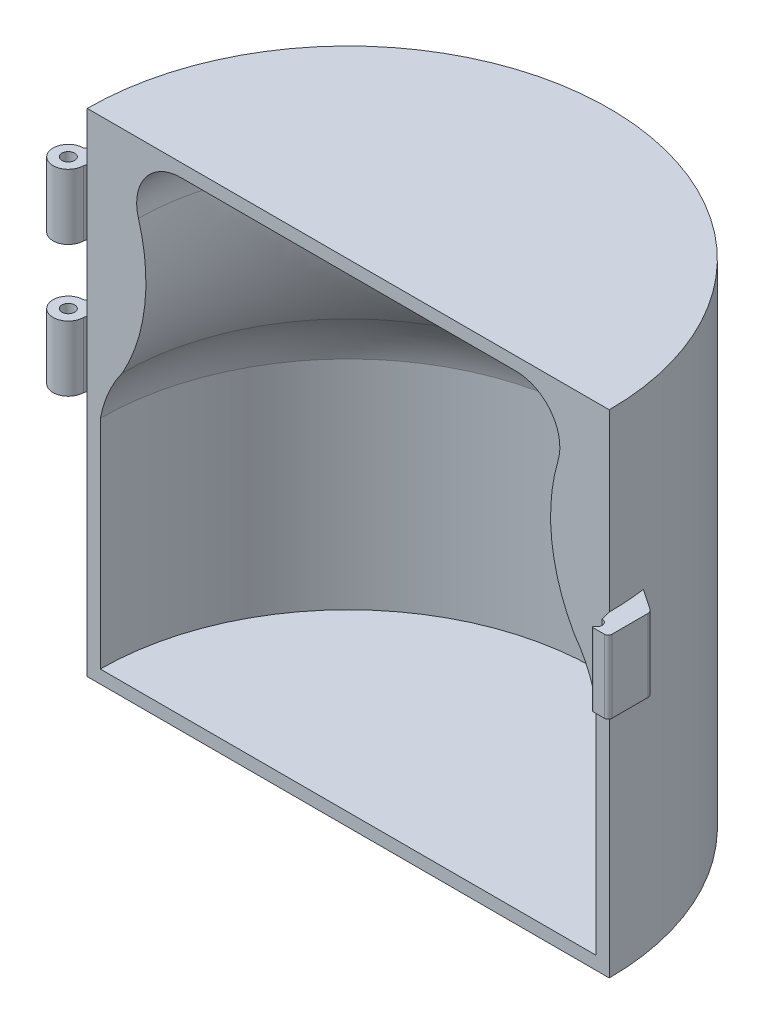
ISO-10303-21;
HEADER;
FILE_DESCRIPTION(('STEP AP214'),'2;1');
FILE_NAME('part.step','',(''),(''),'','','');
FILE_SCHEMA(('AUTOMOTIVE_DESIGN { 1 0 10303 214 1 1 1 1 }'));
ENDSEC;
DATA;
#1=APPLICATION_CONTEXT('core data for automotive mechanical design processes');
#2=APPLICATION_PROTOCOL_DEFINITION('international standard','automotive_design',2000,#1);
#3=PRODUCT_CONTEXT('',#1,'mechanical');
#4=PRODUCT('Part','Part','',(#3));
#5=PRODUCT_RELATED_PRODUCT_CATEGORY('part','',(#4));
#6=PRODUCT_DEFINITION_FORMATION('','',#4);
#7=PRODUCT_DEFINITION_CONTEXT('part definition',#1,'design');
#8=PRODUCT_DEFINITION('design','',#6,#7);
#9=PRODUCT_DEFINITION_SHAPE('','',#8);
#10=(LENGTH_UNIT() NAMED_UNIT(*) SI_UNIT(.MILLI.,.METRE.));
#11=(NAMED_UNIT(*) PLANE_ANGLE_UNIT() SI_UNIT($,.RADIAN.));
#12=(NAMED_UNIT(*) SI_UNIT($,.STERADIAN.) SOLID_ANGLE_UNIT());
#13=UNCERTAINTY_MEASURE_WITH_UNIT(LENGTH_MEASURE(1.E-05),#10,'distance_accuracy_value','');
#14=(GEOMETRIC_REPRESENTATION_CONTEXT(3) GLOBAL_UNCERTAINTY_ASSIGNED_CONTEXT((#13)) GLOBAL_UNIT_ASSIGNED_CONTEXT((#10,
#11,#12)) REPRESENTATION_CONTEXT('',''));
#15=CARTESIAN_POINT('',(0.,0.,0.));
#16=DIRECTION('',(0.,0.,1.));
#17=DIRECTION('',(1.,0.,0.));
#18=AXIS2_PLACEMENT_3D('',#15,#16,#17);
#19=CARTESIAN_POINT('',(-38.45,-5.,0.));
#20=DIRECTION('',(0.,1.,0.));
#21=DIRECTION('',(0.,0.,1.));
#22=AXIS2_PLACEMENT_3D('',#19,#20,#21);
#23=CYLINDRICAL_SURFACE('',#22,2.1);
#24=CARTESIAN_POINT('',(-38.45,13.05,0.));
#25=DIRECTION('',(0.,1.,0.));
#26=DIRECTION('',(0.,0.,1.));
#27=AXIS2_PLACEMENT_3D('',#24,#25,#26);
#28=CIRCLE('',#27,2.1);
#29=CARTESIAN_POINT('',(-36.3500000000001,13.05,-6.34160605863902E-07));
#30=VERTEX_POINT('',#29);
#31=CARTESIAN_POINT('',(-38.45,13.05,-2.1));
#32=VERTEX_POINT('',#31);
#33=EDGE_CURVE('E308',#30,#32,#28,.F.);
#34=ORIENTED_EDGE('',*,*,#33,.F.);
#35=DIRECTION('',(0.,1.,0.));
#36=VECTOR('',#35,1.);
#37=CARTESIAN_POINT('',(-36.3500000000001,-5.,-6.34160605972323E-07));
#38=LINE('',#37,#36);
#39=CARTESIAN_POINT('',(-36.3500000000001,22.,-6.34160605972323E-07));
#40=VERTEX_POINT('',#39);
#41=EDGE_CURVE('E233',#30,#40,#38,.T.);
#42=ORIENTED_EDGE('',*,*,#41,.T.);
#43=CARTESIAN_POINT('',(-38.45,22.,0.));
#44=DIRECTION('',(0.,1.,0.));
#45=DIRECTION('',(0.,0.,1.));
#46=AXIS2_PLACEMENT_3D('',#43,#44,#45);
#47=CIRCLE('',#46,2.1);
#48=CARTESIAN_POINT('',(-38.45,22.,-2.1));
#49=VERTEX_POINT('',#48);
#50=EDGE_CURVE('E392',#49,#40,#47,.T.);
#51=ORIENTED_EDGE('',*,*,#50,.F.);
#52=DIRECTION('',(0.,1.,0.));
#53=VECTOR('',#52,1.);
#54=CARTESIAN_POINT('',(-38.45,-5.,-2.1));
#55=LINE('',#54,#53);
#56=EDGE_CURVE('E221',#32,#49,#55,.T.);
#57=ORIENTED_EDGE('',*,*,#56,.F.);
#58=EDGE_LOOP('',(#34,#42,#51,#57));
#59=FACE_BOUND('',#58,.T.);
#60=ADVANCED_FACE('F33',(#59),#23,.T.);
#61=CARTESIAN_POINT('',(-59.4902150576124,-5.,-29.3458485788646));
#62=DIRECTION('',(0.,1.,0.));
#63=DIRECTION('',(0.,0.,1.));
#64=AXIS2_PLACEMENT_3D('',#61,#62,#63);
#65=CYLINDRICAL_SURFACE('',#64,34.4242198815456);
#66=CARTESIAN_POINT('',(-59.4902150576124,13.05,-29.3458485788646));
#67=DIRECTION('',(0.,1.,0.));
#68=DIRECTION('',(0.,0.,1.));
#69=AXIS2_PLACEMENT_3D('',#66,#67,#68);
#70=CIRCLE('',#69,34.4242198815456);
#71=CARTESIAN_POINT('',(-35.5527923727381,13.05,-4.60667499406875));
#72=VERTEX_POINT('',#71);
#73=EDGE_CURVE('E310',#32,#72,#70,.T.);
#74=ORIENTED_EDGE('',*,*,#73,.F.);
#75=ORIENTED_EDGE('',*,*,#56,.T.);
#76=CARTESIAN_POINT('',(-59.4902150576124,22.,-29.3458485788646));
#77=DIRECTION('',(0.,-1.,0.));
#78=DIRECTION('',(0.,0.,-1.));
#79=AXIS2_PLACEMENT_3D('',#76,#77,#78);
#80=CIRCLE('',#79,34.4242198815456);
#81=CARTESIAN_POINT('',(-35.5527923727381,22.,-4.60667499406874));
#82=VERTEX_POINT('',#81);
#83=EDGE_CURVE('E398',#82,#49,#80,.T.);
#84=ORIENTED_EDGE('',*,*,#83,.F.);
#85=DIRECTION('',(0.,1.,0.));
#86=VECTOR('',#85,1.);
#87=CARTESIAN_POINT('',(-35.5527923727381,-5.,-4.60667499406874));
#88=LINE('',#87,#86);
#89=EDGE_CURVE('E222',#72,#82,#88,.T.);
#90=ORIENTED_EDGE('',*,*,#89,.F.);
#91=EDGE_LOOP('',(#74,#75,#84,#90));
#92=FACE_BOUND('',#91,.T.);
#93=ADVANCED_FACE('F426',(#92),#65,.F.);
#94=CARTESIAN_POINT('',(-34.0891134906964,-5.,0.498090304903012));
#95=DIRECTION('',(0.,1.,0.));
#96=DIRECTION('',(0.,0.,1.));
#97=AXIS2_PLACEMENT_3D('',#94,#95,#96);
#98=CYLINDRICAL_SURFACE('',#97,2.31510310602543);
#99=CARTESIAN_POINT('',(-34.0891134906964,13.05,0.498090304903012));
#100=DIRECTION('',(0.,1.,0.));
#101=DIRECTION('',(0.,0.,1.));
#102=AXIS2_PLACEMENT_3D('',#99,#100,#101);
#103=CIRCLE('',#102,2.31510310602543);
#104=CARTESIAN_POINT('',(-35.8354353622414,13.05,-1.02179860962072));
#105=VERTEX_POINT('',#104);
#106=EDGE_CURVE('E306',#105,#30,#103,.T.);
#107=ORIENTED_EDGE('',*,*,#106,.F.);
#108=DIRECTION('',(0.,1.,0.));
#109=VECTOR('',#108,1.);
#110=CARTESIAN_POINT('',(-35.8354353622413,-5.,-1.02179860962083));
#111=LINE('',#110,#109);
#112=CARTESIAN_POINT('',(-35.8354353622413,22.,-1.02179860962086));
#113=VERTEX_POINT('',#112);
#114=EDGE_CURVE('E229',#105,#113,#111,.T.);
#115=ORIENTED_EDGE('',*,*,#114,.T.);
#116=CARTESIAN_POINT('',(-34.0891134906964,22.,0.498090304903012));
#117=DIRECTION('',(0.,-1.,0.));
#118=DIRECTION('',(0.,0.,-1.));
#119=AXIS2_PLACEMENT_3D('',#116,#117,#118);
#120=CIRCLE('',#119,2.31510310602543);
#121=EDGE_CURVE('E395',#40,#113,#120,.T.);
#122=ORIENTED_EDGE('',*,*,#121,.F.);
#123=ORIENTED_EDGE('',*,*,#41,.F.);
#124=EDGE_LOOP('',(#107,#115,#122,#123));
#125=FACE_BOUND('',#124,.T.);
#126=ADVANCED_FACE('F416',(#125),#98,.F.);
#127=CARTESIAN_POINT('',(-38.45,-5.,0.));
#128=DIRECTION('',(0.,1.,0.));
#129=DIRECTION('',(0.,0.,1.));
#130=AXIS2_PLACEMENT_3D('',#127,#128,#129);
#131=CYLINDRICAL_SURFACE('',#130,0.874999999999998);
#132=CARTESIAN_POINT('',(-38.45,13.05,0.));
#133=DIRECTION('',(0.,1.,0.));
#134=DIRECTION('',(0.,0.,1.));
#135=AXIS2_PLACEMENT_3D('',#132,#133,#134);
#136=CIRCLE('',#135,0.874999999999998);
#137=CARTESIAN_POINT('',(-38.45,13.05,0.874999999999998));
#138=VERTEX_POINT('',#137);
#139=EDGE_CURVE('E37',#138,#138,#136,.F.);
#140=ORIENTED_EDGE('',*,*,#139,.T.);
#141=EDGE_LOOP('',(#140));
#142=FACE_BOUND('',#141,.T.);
#143=CARTESIAN_POINT('',(-38.45,22.,0.));
#144=DIRECTION('',(0.,1.,0.));
#145=DIRECTION('',(0.,0.,1.));
#146=AXIS2_PLACEMENT_3D('',#143,#144,#145);
#147=CIRCLE('',#146,0.874999999999998);
#148=CARTESIAN_POINT('',(-38.45,22.,0.874999999999998));
#149=VERTEX_POINT('',#148);
#150=EDGE_CURVE('E371',#149,#149,#147,.T.);
#151=ORIENTED_EDGE('',*,*,#150,.T.);
#152=EDGE_LOOP('',(#151));
#153=FACE_BOUND('',#152,.T.);
#154=ADVANCED_FACE('F432',(#142,#153),#131,.F.);
#155=CARTESIAN_POINT('',(0.,0.,0.));
#156=DIRECTION('',(0.,-1.,0.));
#157=DIRECTION('',(0.,0.,-1.));
#158=AXIS2_PLACEMENT_3D('',#155,#156,#157);
#159=CYLINDRICAL_SURFACE('',#158,35.85);
#160=ORIENTED_EDGE('',*,*,#114,.F.);
#161=CARTESIAN_POINT('',(0.,13.05,0.));
#162=DIRECTION('',(0.,1.,0.));
#163=DIRECTION('',(0.,0.,1.));
#164=AXIS2_PLACEMENT_3D('',#161,#162,#163);
#165=CIRCLE('',#164,35.85);
#166=EDGE_CURVE('E208',#72,#105,#165,.T.);
#167=ORIENTED_EDGE('',*,*,#166,.F.);
#168=ORIENTED_EDGE('',*,*,#89,.T.);
#169=CARTESIAN_POINT('',(0.,22.,0.));
#170=DIRECTION('',(0.,1.,0.));
#171=DIRECTION('',(0.,0.,1.));
#172=AXIS2_PLACEMENT_3D('',#169,#170,#171);
#173=CIRCLE('',#172,35.85);
#174=EDGE_CURVE('E42',#113,#82,#173,.F.);
#175=ORIENTED_EDGE('',*,*,#174,.F.);
#176=EDGE_LOOP('',(#160,#167,#168,#175));
#177=FACE_BOUND('',#176,.T.);
#178=DIRECTION('',(0.,1.,0.));
#179=VECTOR('',#178,1.);
#180=CARTESIAN_POINT('',(-35.85,29.0591591337267,2.50339211995053E-13));
#181=LINE('',#180,#179);
#182=CARTESIAN_POINT('',(-35.85,-38.5269912109226,2.50339211995053E-13));
#183=VERTEX_POINT('',#182);
#184=CARTESIAN_POINT('',(-35.85,29.0591591337267,2.50339211995053E-13));
#185=VERTEX_POINT('',#184);
#186=EDGE_CURVE('E270',#183,#185,#181,.T.);
#187=ORIENTED_EDGE('',*,*,#186,.T.);
#188=CARTESIAN_POINT('',(0.,29.0591591337267,0.));
#189=DIRECTION('',(0.,-1.,0.));
#190=DIRECTION('',(0.,0.,-1.));
#191=AXIS2_PLACEMENT_3D('',#188,#189,#190);
#192=CIRCLE('',#191,35.85);
#193=CARTESIAN_POINT('',(35.85,29.0591591337267,0.));
#194=VERTEX_POINT('',#193);
#195=EDGE_CURVE('E290',#185,#194,#192,.T.);
#196=ORIENTED_EDGE('',*,*,#195,.T.);
#197=DIRECTION('',(0.,1.,0.));
#198=VECTOR('',#197,1.);
#199=CARTESIAN_POINT('',(35.85,29.0591591337267,0.));
#200=LINE('',#199,#198);
#201=CARTESIAN_POINT('',(35.85,5.,0.));
#202=VERTEX_POINT('',#201);
#203=EDGE_CURVE('E246',#202,#194,#200,.T.);
#204=ORIENTED_EDGE('',*,*,#203,.F.);
#205=CARTESIAN_POINT('',(0.,5.,0.));
#206=DIRECTION('',(0.,-1.,0.));
#207=DIRECTION('',(0.,0.,-1.));
#208=AXIS2_PLACEMENT_3D('',#205,#206,#207);
#209=CIRCLE('',#208,35.85);
#210=CARTESIAN_POINT('',(35.4945281124585,5.,-5.03596803741779));
#211=VERTEX_POINT('',#210);
#212=EDGE_CURVE('E336',#211,#202,#209,.T.);
#213=ORIENTED_EDGE('',*,*,#212,.F.);
#214=DIRECTION('',(0.,1.,0.));
#215=VECTOR('',#214,1.);
#216=CARTESIAN_POINT('',(35.4945281124585,-5.,-5.03596803741779));
#217=LINE('',#216,#215);
#218=CARTESIAN_POINT('',(35.4945281124585,-5.,-5.03596803741779));
#219=VERTEX_POINT('',#218);
#220=EDGE_CURVE('E375',#219,#211,#217,.T.);
#221=ORIENTED_EDGE('',*,*,#220,.F.);
#222=CARTESIAN_POINT('',(0.,-5.,0.));
#223=DIRECTION('',(0.,-1.,0.));
#224=DIRECTION('',(0.,0.,-1.));
#225=AXIS2_PLACEMENT_3D('',#222,#223,#224);
#226=CIRCLE('',#225,35.85);
#227=CARTESIAN_POINT('',(35.85,-5.,0.));
#228=VERTEX_POINT('',#227);
#229=EDGE_CURVE('E362',#219,#228,#226,.T.);
#230=ORIENTED_EDGE('',*,*,#229,.T.);
#231=CARTESIAN_POINT('',(35.85,-38.5269912109226,0.));
#232=VERTEX_POINT('',#231);
#233=EDGE_CURVE('E247',#232,#228,#200,.T.);
#234=ORIENTED_EDGE('',*,*,#233,.F.);
#235=CARTESIAN_POINT('',(0.,-38.5269912109226,0.));
#236=DIRECTION('',(0.,-1.,0.));
#237=DIRECTION('',(0.,0.,-1.));
#238=AXIS2_PLACEMENT_3D('',#235,#236,#237);
#239=CIRCLE('',#238,35.85);
#240=EDGE_CURVE('E287',#183,#232,#239,.T.);
#241=ORIENTED_EDGE('',*,*,#240,.F.);
#242=EDGE_LOOP('',(#187,#196,#204,#213,#221,#230,#234,#241));
#243=FACE_BOUND('',#242,.T.);
#244=CARTESIAN_POINT('',(-35.5527923727381,-5.,-4.60667499406871));
#245=VERTEX_POINT('',#244);
#246=CARTESIAN_POINT('',(-35.5527923727381,3.95,-4.60667499406875));
#247=VERTEX_POINT('',#246);
#248=EDGE_CURVE('E215',#245,#247,#88,.T.);
#249=ORIENTED_EDGE('',*,*,#248,.T.);
#250=CARTESIAN_POINT('',(0.,3.95,0.));
#251=DIRECTION('',(0.,1.,0.));
#252=DIRECTION('',(0.,0.,1.));
#253=AXIS2_PLACEMENT_3D('',#250,#251,#252);
#254=CIRCLE('',#253,35.85);
#255=CARTESIAN_POINT('',(-35.8354353622414,3.95,-1.02179860962072));
#256=VERTEX_POINT('',#255);
#257=EDGE_CURVE('E199',#247,#256,#254,.T.);
#258=ORIENTED_EDGE('',*,*,#257,.T.);
#259=CARTESIAN_POINT('',(-35.8354353622413,-5.,-1.02179860962089));
#260=VERTEX_POINT('',#259);
#261=EDGE_CURVE('E225',#260,#256,#111,.T.);
#262=ORIENTED_EDGE('',*,*,#261,.F.);
#263=CARTESIAN_POINT('',(0.,-5.,0.));
#264=DIRECTION('',(0.,1.,0.));
#265=DIRECTION('',(0.,0.,1.));
#266=AXIS2_PLACEMENT_3D('',#263,#264,#265);
#267=CIRCLE('',#266,35.85);
#268=EDGE_CURVE('E11',#260,#245,#267,.F.);
#269=ORIENTED_EDGE('',*,*,#268,.T.);
#270=EDGE_LOOP('',(#249,#258,#262,#269));
#271=FACE_BOUND('',#270,.T.);
#272=ADVANCED_FACE('F219',(#177,#243,#271),#159,.T.);
#273=CARTESIAN_POINT('',(0.,29.0591591337267,0.));
#274=DIRECTION('',(0.,1.,0.));
#275=DIRECTION('',(0.,0.,1.));
#276=AXIS2_PLACEMENT_3D('',#273,#274,#275);
#277=PLANE('',#276);
#278=ORIENTED_EDGE('',*,*,#195,.F.);
#279=DIRECTION('',(1.,0.,0.));
#280=VECTOR('',#279,1.);
#281=CARTESIAN_POINT('',(0.,29.0591591337267,0.));
#282=LINE('',#281,#280);
#283=EDGE_CURVE('E272',#185,#194,#282,.T.);
#284=ORIENTED_EDGE('',*,*,#283,.T.);
#285=EDGE_LOOP('',(#278,#284));
#286=FACE_BOUND('',#285,.T.);
#287=ADVANCED_FACE('F35',(#286),#277,.T.);
#288=CARTESIAN_POINT('',(-35.85,-38.5269912109226,2.50339211995053E-13));
#289=DIRECTION('',(0.,-1.,0.));
#290=DIRECTION('',(0.,0.,-1.));
#291=AXIS2_PLACEMENT_3D('',#288,#289,#290);
#292=PLANE('',#291);
#293=ORIENTED_EDGE('',*,*,#240,.T.);
#294=DIRECTION('',(-1.,0.,0.));
#295=VECTOR('',#294,1.);
#296=CARTESIAN_POINT('',(-35.85,-38.5269912109226,2.50339211995053E-13));
#297=LINE('',#296,#295);
#298=EDGE_CURVE('E267',#232,#183,#297,.T.);
#299=ORIENTED_EDGE('',*,*,#298,.T.);
#300=EDGE_LOOP('',(#293,#299));
#301=FACE_BOUND('',#300,.T.);
#302=ADVANCED_FACE('F756',(#301),#292,.T.);
#303=CARTESIAN_POINT('',(0.,-36.7269912109226,0.));
#304=DIRECTION('',(0.,1.,0.));
#305=DIRECTION('',(0.,0.,1.));
#306=AXIS2_PLACEMENT_3D('',#303,#304,#305);
#307=PLANE('',#306);
#308=CARTESIAN_POINT('',(0.,-36.7269912109226,0.));
#309=DIRECTION('',(0.,-1.,0.));
#310=DIRECTION('',(0.,0.,-1.));
#311=AXIS2_PLACEMENT_3D('',#308,#309,#310);
#312=CIRCLE('',#311,34.05);
#313=CARTESIAN_POINT('',(-34.05,-36.7269912109226,2.37769879175217E-13));
#314=VERTEX_POINT('',#313);
#315=CARTESIAN_POINT('',(34.05,-36.7269912109226,0.));
#316=VERTEX_POINT('',#315);
#317=EDGE_CURVE('E284',#314,#316,#312,.T.);
#318=ORIENTED_EDGE('',*,*,#317,.F.);
#319=DIRECTION('',(1.,0.,0.));
#320=VECTOR('',#319,1.);
#321=CARTESIAN_POINT('',(0.,-36.7269912109226,0.));
#322=LINE('',#321,#320);
#323=EDGE_CURVE('E265',#314,#316,#322,.T.);
#324=ORIENTED_EDGE('',*,*,#323,.T.);
#325=EDGE_LOOP('',(#318,#324));
#326=FACE_BOUND('',#325,.T.);
#327=ADVANCED_FACE('F746',(#326),#307,.T.);
#328=CARTESIAN_POINT('',(0.,0.,0.));
#329=DIRECTION('',(0.,-1.,0.));
#330=DIRECTION('',(0.,0.,-1.));
#331=AXIS2_PLACEMENT_3D('',#328,#329,#330);
#332=CYLINDRICAL_SURFACE('',#331,34.05);
#333=CARTESIAN_POINT('',(0.,-6.89650099036191,0.));
#334=DIRECTION('',(0.,-1.,0.));
#335=DIRECTION('',(0.,0.,-1.));
#336=AXIS2_PLACEMENT_3D('',#333,#334,#335);
#337=CIRCLE('',#336,34.05);
#338=CARTESIAN_POINT('',(-34.05,-6.89650099036191,2.37769879175217E-13));
#339=VERTEX_POINT('',#338);
#340=CARTESIAN_POINT('',(34.05,-6.89650099036191,0.));
#341=VERTEX_POINT('',#340);
#342=EDGE_CURVE('E282',#339,#341,#337,.T.);
#343=ORIENTED_EDGE('',*,*,#342,.F.);
#344=DIRECTION('',(0.,-1.,0.));
#345=VECTOR('',#344,1.);
#346=CARTESIAN_POINT('',(-34.05,-36.7269912109226,2.37769879175217E-13));
#347=LINE('',#346,#345);
#348=EDGE_CURVE('E262',#339,#314,#347,.T.);
#349=ORIENTED_EDGE('',*,*,#348,.T.);
#350=ORIENTED_EDGE('',*,*,#317,.T.);
#351=DIRECTION('',(0.,-1.,0.));
#352=VECTOR('',#351,1.);
#353=CARTESIAN_POINT('',(34.05,-36.7269912109226,0.));
#354=LINE('',#353,#352);
#355=EDGE_CURVE('E243',#341,#316,#354,.T.);
#356=ORIENTED_EDGE('',*,*,#355,.F.);
#357=EDGE_LOOP('',(#343,#349,#350,#356));
#358=FACE_BOUND('',#357,.T.);
#359=ADVANCED_FACE('F736',(#358),#332,.F.);
#360=CARTESIAN_POINT('',(0.,-10.1856188509149,0.));
#361=DIRECTION('',(0.,-1.,0.));
#362=DIRECTION('',(0.,0.,-1.));
#363=AXIS2_PLACEMENT_3D('',#360,#361,#362);
#364=DEGENERATE_TOROIDAL_SURFACE('',#363,17.14840529501,17.2186584806237,.T.);
#365=CARTESIAN_POINT('',(0.,0.0271496236617253,0.));
#366=DIRECTION('',(0.,-1.,0.));
#367=DIRECTION('',(0.,0.,-1.));
#368=AXIS2_PLACEMENT_3D('',#365,#366,#367);
#369=CIRCLE('',#368,31.011361688112);
#370=CARTESIAN_POINT('',(-31.011361688112,0.0271496236617253,2.16551181252316E-13));
#371=VERTEX_POINT('',#370);
#372=CARTESIAN_POINT('',(31.011361688112,0.0271496236617253,0.));
#373=VERTEX_POINT('',#372);
#374=EDGE_CURVE('E280',#371,#373,#369,.T.);
#375=ORIENTED_EDGE('',*,*,#374,.F.);
#376=CARTESIAN_POINT('',(-17.14840529501,-10.1856188509149,1.19746674156893E-13));
#377=DIRECTION('',(0.,0.,1.));
#378=DIRECTION('',(1.,0.,0.));
#379=AXIS2_PLACEMENT_3D('',#376,#377,#378);
#380=CIRCLE('',#379,17.2186584806237);
#381=EDGE_CURVE('E259',#371,#339,#380,.T.);
#382=ORIENTED_EDGE('',*,*,#381,.T.);
#383=ORIENTED_EDGE('',*,*,#342,.T.);
#384=CARTESIAN_POINT('',(17.14840529501,-10.1856188509149,0.));
#385=DIRECTION('',(0.,0.,-1.));
#386=DIRECTION('',(-1.,0.,0.));
#387=AXIS2_PLACEMENT_3D('',#384,#385,#386);
#388=CIRCLE('',#387,17.2186584806237);
#389=EDGE_CURVE('E240',#373,#341,#388,.T.);
#390=ORIENTED_EDGE('',*,*,#389,.F.);
#391=EDGE_LOOP('',(#375,#382,#383,#390));
#392=FACE_BOUND('',#391,.T.);
#393=ADVANCED_FACE('F726',(#392),#364,.F.);
#394=CARTESIAN_POINT('',(0.,12.3742670743194,0.));
#395=DIRECTION('',(0.,-1.,0.));
#396=DIRECTION('',(0.,0.,-1.));
#397=AXIS2_PLACEMENT_3D('',#394,#395,#396);
#398=TOROIDAL_SURFACE('',#397,53.0641731807485,25.2740539698343);
#399=CARTESIAN_POINT('',(0.,19.5027677129071,0.));
#400=DIRECTION('',(0.,-1.,0.));
#401=DIRECTION('',(0.,0.,-1.));
#402=AXIS2_PLACEMENT_3D('',#399,#400,#401);
#403=CIRCLE('',#402,28.8162396045497);
#404=CARTESIAN_POINT('',(-28.8162396045497,19.5027677129071,2.01222725669836E-13));
#405=VERTEX_POINT('',#404);
#406=CARTESIAN_POINT('',(28.8162396045497,19.5027677129071,0.));
#407=VERTEX_POINT('',#406);
#408=EDGE_CURVE('E278',#405,#407,#403,.T.);
#409=ORIENTED_EDGE('',*,*,#408,.F.);
#410=CARTESIAN_POINT('',(-53.0641731807485,12.3742670743194,3.70545140843448E-13));
#411=DIRECTION('',(0.,0.,-1.));
#412=DIRECTION('',(1.,0.,0.));
#413=AXIS2_PLACEMENT_3D('',#410,#411,#412);
#414=CIRCLE('',#413,25.2740539698343);
#415=EDGE_CURVE('E256',#405,#371,#414,.T.);
#416=ORIENTED_EDGE('',*,*,#415,.T.);
#417=ORIENTED_EDGE('',*,*,#374,.T.);
#418=CARTESIAN_POINT('',(53.0641731807485,12.3742670743194,0.));
#419=DIRECTION('',(0.,0.,1.));
#420=DIRECTION('',(-1.,0.,0.));
#421=AXIS2_PLACEMENT_3D('',#418,#419,#420);
#422=CIRCLE('',#421,25.2740539698343);
#423=EDGE_CURVE('E237',#407,#373,#422,.T.);
#424=ORIENTED_EDGE('',*,*,#423,.F.);
#425=EDGE_LOOP('',(#409,#416,#417,#424));
#426=FACE_BOUND('',#425,.T.);
#427=ADVANCED_FACE('F716',(#426),#398,.T.);
#428=CARTESIAN_POINT('',(0.,21.2091591337267,0.));
#429=DIRECTION('',(0.,-1.,0.));
#430=DIRECTION('',(0.,0.,-1.));
#431=AXIS2_PLACEMENT_3D('',#428,#429,#430);
#432=TOROIDAL_SURFACE('',#431,23.0118681210079,6.05);
#433=CARTESIAN_POINT('',(0.,27.2591591337267,0.));
#434=DIRECTION('',(0.,-1.,0.));
#435=DIRECTION('',(0.,0.,-1.));
#436=AXIS2_PLACEMENT_3D('',#433,#434,#435);
#437=CIRCLE('',#436,23.0118681210079);
#438=CARTESIAN_POINT('',(-23.0118681210079,27.2591591337267,1.60691016232837E-13));
#439=VERTEX_POINT('',#438);
#440=CARTESIAN_POINT('',(23.0118681210079,27.2591591337267,0.));
#441=VERTEX_POINT('',#440);
#442=EDGE_CURVE('E275',#439,#441,#437,.T.);
#443=ORIENTED_EDGE('',*,*,#442,.F.);
#444=CARTESIAN_POINT('',(-23.0118681210079,21.2091591337267,1.60691016232837E-13));
#445=DIRECTION('',(0.,0.,1.));
#446=DIRECTION('',(-1.,0.,0.));
#447=AXIS2_PLACEMENT_3D('',#444,#445,#446);
#448=CIRCLE('',#447,6.05);
#449=EDGE_CURVE('E253',#439,#405,#448,.T.);
#450=ORIENTED_EDGE('',*,*,#449,.T.);
#451=ORIENTED_EDGE('',*,*,#408,.T.);
#452=CARTESIAN_POINT('',(23.0118681210079,21.2091591337267,0.));
#453=DIRECTION('',(0.,0.,-1.));
#454=DIRECTION('',(1.,0.,0.));
#455=AXIS2_PLACEMENT_3D('',#452,#453,#454);
#456=CIRCLE('',#455,6.05);
#457=EDGE_CURVE('E234',#441,#407,#456,.T.);
#458=ORIENTED_EDGE('',*,*,#457,.F.);
#459=EDGE_LOOP('',(#443,#450,#451,#458));
#460=FACE_BOUND('',#459,.T.);
#461=ADVANCED_FACE('F706',(#460),#432,.F.);
#462=CARTESIAN_POINT('',(0.,27.2591591337267,0.));
#463=DIRECTION('',(0.,-1.,0.));
#464=DIRECTION('',(0.,0.,-1.));
#465=AXIS2_PLACEMENT_3D('',#462,#463,#464);
#466=PLANE('',#465);
#467=DIRECTION('',(-1.,0.,0.));
#468=VECTOR('',#467,1.);
#469=CARTESIAN_POINT('',(0.,27.2591591337267,0.));
#470=LINE('',#469,#468);
#471=EDGE_CURVE('E250',#441,#439,#470,.T.);
#472=ORIENTED_EDGE('',*,*,#471,.T.);
#473=ORIENTED_EDGE('',*,*,#442,.T.);
#474=EDGE_LOOP('',(#472,#473));
#475=FACE_BOUND('',#474,.T.);
#476=ADVANCED_FACE('F506',(#475),#466,.T.);
#477=CARTESIAN_POINT('',(-17.14840529501,-10.1856188509149,1.19746674156893E-13));
#478=DIRECTION('',(0.,0.,1.));
#479=DIRECTION('',(1.,0.,0.));
#480=AXIS2_PLACEMENT_3D('',#477,#478,#479);
#481=PLANE('',#480);
#482=ORIENTED_EDGE('',*,*,#471,.F.);
#483=ORIENTED_EDGE('',*,*,#457,.T.);
#484=ORIENTED_EDGE('',*,*,#423,.T.);
#485=ORIENTED_EDGE('',*,*,#389,.T.);
#486=ORIENTED_EDGE('',*,*,#355,.T.);
#487=ORIENTED_EDGE('',*,*,#323,.F.);
#488=ORIENTED_EDGE('',*,*,#348,.F.);
#489=ORIENTED_EDGE('',*,*,#381,.F.);
#490=ORIENTED_EDGE('',*,*,#415,.F.);
#491=ORIENTED_EDGE('',*,*,#449,.F.);
#492=EDGE_LOOP('',(#482,#483,#484,#485,#486,#487,#488,#489,#490,#491));
#493=FACE_BOUND('',#492,.T.);
#494=ORIENTED_EDGE('',*,*,#233,.T.);
#495=DIRECTION('',(0.,1.,0.));
#496=VECTOR('',#495,1.);
#497=CARTESIAN_POINT('',(35.85,-5.,0.));
#498=LINE('',#497,#496);
#499=EDGE_CURVE('E372',#228,#202,#498,.T.);
#500=ORIENTED_EDGE('',*,*,#499,.T.);
#501=ORIENTED_EDGE('',*,*,#203,.T.);
#502=ORIENTED_EDGE('',*,*,#283,.F.);
#503=ORIENTED_EDGE('',*,*,#186,.F.);
#504=ORIENTED_EDGE('',*,*,#298,.F.);
#505=EDGE_LOOP('',(#494,#500,#501,#502,#503,#504));
#506=FACE_BOUND('',#505,.T.);
#507=ADVANCED_FACE('F440',(#493,#506),#481,.T.);
#508=CARTESIAN_POINT('',(-36.3500000000001,-5.,-6.34160605972323E-07));
#509=VERTEX_POINT('',#508);
#510=CARTESIAN_POINT('',(-36.3500000000001,3.95,-6.34160605972323E-07));
#511=VERTEX_POINT('',#510);
#512=EDGE_CURVE('E230',#509,#511,#38,.T.);
#513=ORIENTED_EDGE('',*,*,#512,.T.);
#514=CARTESIAN_POINT('',(-38.45,3.95,0.));
#515=DIRECTION('',(0.,-1.,0.));
#516=DIRECTION('',(0.,0.,-1.));
#517=AXIS2_PLACEMENT_3D('',#514,#515,#516);
#518=CIRCLE('',#517,2.1);
#519=CARTESIAN_POINT('',(-38.45,3.95,-2.1));
#520=VERTEX_POINT('',#519);
#521=EDGE_CURVE('E50',#520,#511,#518,.F.);
#522=ORIENTED_EDGE('',*,*,#521,.F.);
#523=CARTESIAN_POINT('',(-38.45,-5.,-2.1));
#524=VERTEX_POINT('',#523);
#525=EDGE_CURVE('E217',#524,#520,#55,.T.);
#526=ORIENTED_EDGE('',*,*,#525,.F.);
#527=CARTESIAN_POINT('',(-38.45,-5.,0.));
#528=DIRECTION('',(0.,1.,0.));
#529=DIRECTION('',(0.,0.,1.));
#530=AXIS2_PLACEMENT_3D('',#527,#528,#529);
#531=CIRCLE('',#530,2.1);
#532=EDGE_CURVE('E404',#524,#509,#531,.T.);
#533=ORIENTED_EDGE('',*,*,#532,.T.);
#534=EDGE_LOOP('',(#513,#522,#526,#533));
#535=FACE_BOUND('',#534,.T.);
#536=ADVANCED_FACE('F492',(#535),#23,.T.);
#537=CARTESIAN_POINT('',(-59.4902150576124,3.95,-29.3458485788646));
#538=DIRECTION('',(0.,-1.,0.));
#539=DIRECTION('',(0.,0.,-1.));
#540=AXIS2_PLACEMENT_3D('',#537,#538,#539);
#541=CIRCLE('',#540,34.4242198815456);
#542=EDGE_CURVE('E203',#247,#520,#541,.T.);
#543=ORIENTED_EDGE('',*,*,#542,.F.);
#544=ORIENTED_EDGE('',*,*,#248,.F.);
#545=CARTESIAN_POINT('',(-59.4902150576124,-5.,-29.3458485788646));
#546=DIRECTION('',(0.,-1.,0.));
#547=DIRECTION('',(0.,0.,-1.));
#548=AXIS2_PLACEMENT_3D('',#545,#546,#547);
#549=CIRCLE('',#548,34.4242198815456);
#550=EDGE_CURVE('E409',#245,#524,#549,.T.);
#551=ORIENTED_EDGE('',*,*,#550,.T.);
#552=ORIENTED_EDGE('',*,*,#525,.T.);
#553=EDGE_LOOP('',(#543,#544,#551,#552));
#554=FACE_BOUND('',#553,.T.);
#555=ADVANCED_FACE('F213',(#554),#65,.F.);
#556=CARTESIAN_POINT('',(-34.0891134906964,3.95,0.498090304903012));
#557=DIRECTION('',(0.,-1.,0.));
#558=DIRECTION('',(0.,0.,-1.));
#559=AXIS2_PLACEMENT_3D('',#556,#557,#558);
#560=CIRCLE('',#559,2.31510310602543);
#561=EDGE_CURVE('E204',#511,#256,#560,.T.);
#562=ORIENTED_EDGE('',*,*,#561,.F.);
#563=ORIENTED_EDGE('',*,*,#512,.F.);
#564=CARTESIAN_POINT('',(-34.0891134906964,-5.,0.498090304903012));
#565=DIRECTION('',(0.,-1.,0.));
#566=DIRECTION('',(0.,0.,-1.));
#567=AXIS2_PLACEMENT_3D('',#564,#565,#566);
#568=CIRCLE('',#567,2.31510310602543);
#569=EDGE_CURVE('E407',#509,#260,#568,.T.);
#570=ORIENTED_EDGE('',*,*,#569,.T.);
#571=ORIENTED_EDGE('',*,*,#261,.T.);
#572=EDGE_LOOP('',(#562,#563,#570,#571));
#573=FACE_BOUND('',#572,.T.);
#574=ADVANCED_FACE('F505',(#573),#98,.F.);
#575=CARTESIAN_POINT('',(-38.45,-5.,0.));
#576=DIRECTION('',(0.,1.,0.));
#577=DIRECTION('',(0.,0.,1.));
#578=AXIS2_PLACEMENT_3D('',#575,#576,#577);
#579=PLANE('',#578);
#580=ORIENTED_EDGE('',*,*,#268,.F.);
#581=ORIENTED_EDGE('',*,*,#569,.F.);
#582=ORIENTED_EDGE('',*,*,#532,.F.);
#583=ORIENTED_EDGE('',*,*,#550,.F.);
#584=EDGE_LOOP('',(#580,#581,#582,#583));
#585=FACE_BOUND('',#584,.T.);
#586=CARTESIAN_POINT('',(-38.45,-5.,0.));
#587=DIRECTION('',(0.,1.,0.));
#588=DIRECTION('',(0.,0.,1.));
#589=AXIS2_PLACEMENT_3D('',#586,#587,#588);
#590=CIRCLE('',#589,0.874999999999998);
#591=CARTESIAN_POINT('',(-38.45,-5.,0.874999999999998));
#592=VERTEX_POINT('',#591);
#593=EDGE_CURVE('E401',#592,#592,#590,.T.);
#594=ORIENTED_EDGE('',*,*,#593,.T.);
#595=EDGE_LOOP('',(#594));
#596=FACE_BOUND('',#595,.T.);
#597=ADVANCED_FACE('F512',(#585,#596),#579,.F.);
#598=CARTESIAN_POINT('',(-38.45,3.95,0.));
#599=DIRECTION('',(0.,-1.,0.));
#600=DIRECTION('',(0.,0.,-1.));
#601=AXIS2_PLACEMENT_3D('',#598,#599,#600);
#602=CIRCLE('',#601,0.874999999999998);
#603=CARTESIAN_POINT('',(-38.45,3.95,-0.874999999999998));
#604=VERTEX_POINT('',#603);
#605=EDGE_CURVE('E294',#604,#604,#602,.F.);
#606=ORIENTED_EDGE('',*,*,#605,.T.);
#607=EDGE_LOOP('',(#606));
#608=FACE_BOUND('',#607,.T.);
#609=ORIENTED_EDGE('',*,*,#593,.F.);
#610=EDGE_LOOP('',(#609));
#611=FACE_BOUND('',#610,.T.);
#612=ADVANCED_FACE('F515',(#608,#611),#131,.F.);
#613=CARTESIAN_POINT('',(-38.45,22.,0.));
#614=DIRECTION('',(0.,1.,0.));
#615=DIRECTION('',(0.,0.,1.));
#616=AXIS2_PLACEMENT_3D('',#613,#614,#615);
#617=PLANE('',#616);
#618=ORIENTED_EDGE('',*,*,#121,.T.);
#619=ORIENTED_EDGE('',*,*,#174,.T.);
#620=ORIENTED_EDGE('',*,*,#83,.T.);
#621=ORIENTED_EDGE('',*,*,#50,.T.);
#622=EDGE_LOOP('',(#618,#619,#620,#621));
#623=FACE_BOUND('',#622,.T.);
#624=ORIENTED_EDGE('',*,*,#150,.F.);
#625=EDGE_LOOP('',(#624));
#626=FACE_BOUND('',#625,.T.);
#627=ADVANCED_FACE('F420',(#623,#626),#617,.T.);
#628=CARTESIAN_POINT('',(36.1658506740443,-5.,2.08402297534064));
#629=DIRECTION('',(0.,1.,0.));
#630=DIRECTION('',(0.,0.,1.));
#631=AXIS2_PLACEMENT_3D('',#628,#629,#630);
#632=CYLINDRICAL_SURFACE('',#631,0.775533881969196);
#633=DIRECTION('',(0.,1.,0.));
#634=VECTOR('',#633,1.);
#635=CARTESIAN_POINT('',(36.4151433775961,-5.,2.81839750515364));
#636=LINE('',#635,#634);
#637=CARTESIAN_POINT('',(36.4151433775961,-5.,2.81839750515364));
#638=VERTEX_POINT('',#637);
#639=CARTESIAN_POINT('',(36.4151433775961,5.,2.81839750515364));
#640=VERTEX_POINT('',#639);
#641=EDGE_CURVE('E368',#638,#640,#636,.T.);
#642=ORIENTED_EDGE('',*,*,#641,.T.);
#643=CARTESIAN_POINT('',(36.1658506740443,5.,2.08402297534064));
#644=DIRECTION('',(0.,-1.,0.));
#645=DIRECTION('',(0.,0.,-1.));
#646=AXIS2_PLACEMENT_3D('',#643,#644,#645);
#647=CIRCLE('',#646,0.775533881969196);
#648=CARTESIAN_POINT('',(36.1946222239194,5.,1.30902297534064));
#649=VERTEX_POINT('',#648);
#650=EDGE_CURVE('E312',#649,#640,#647,.T.);
#651=ORIENTED_EDGE('',*,*,#650,.F.);
#652=DIRECTION('',(0.,1.,0.));
#653=VECTOR('',#652,1.);
#654=CARTESIAN_POINT('',(36.1946222239194,-5.,1.30902297534064));
#655=LINE('',#654,#653);
#656=CARTESIAN_POINT('',(36.1946222239194,-5.,1.30902297534064));
#657=VERTEX_POINT('',#656);
#658=EDGE_CURVE('E369',#657,#649,#655,.T.);
#659=ORIENTED_EDGE('',*,*,#658,.F.);
#660=CARTESIAN_POINT('',(36.1658506740443,-5.,2.08402297534064));
#661=DIRECTION('',(0.,-1.,0.));
#662=DIRECTION('',(0.,0.,-1.));
#663=AXIS2_PLACEMENT_3D('',#660,#661,#662);
#664=CIRCLE('',#663,0.775533881969196);
#665=EDGE_CURVE('E339',#657,#638,#664,.T.);
#666=ORIENTED_EDGE('',*,*,#665,.T.);
#667=EDGE_LOOP('',(#642,#651,#659,#666));
#668=FACE_BOUND('',#667,.T.);
#669=ADVANCED_FACE('F479',(#668),#632,.F.);
#670=CARTESIAN_POINT('',(36.1946222239194,-5.,1.30902297534064));
#671=DIRECTION('',(-0.967048624328314,0.,0.254591748068778));
#672=DIRECTION('',(0.254591748068778,0.,0.967048624328314));
#673=AXIS2_PLACEMENT_3D('',#670,#671,#672);
#674=PLANE('',#673);
#675=ORIENTED_EDGE('',*,*,#658,.T.);
#676=DIRECTION('',(0.254591748068778,0.,0.967048624328314));
#677=VECTOR('',#676,1.);
#678=CARTESIAN_POINT('',(36.1946222239194,5.,1.30902297534064));
#679=LINE('',#678,#677);
#680=EDGE_CURVE('E58',#202,#649,#679,.T.);
#681=ORIENTED_EDGE('',*,*,#680,.F.);
#682=ORIENTED_EDGE('',*,*,#499,.F.);
#683=DIRECTION('',(0.254591748068778,0.,0.967048624328314));
#684=VECTOR('',#683,1.);
#685=CARTESIAN_POINT('',(36.1946222239194,-5.,1.30902297534064));
#686=LINE('',#685,#684);
#687=EDGE_CURVE('E365',#228,#657,#686,.T.);
#688=ORIENTED_EDGE('',*,*,#687,.T.);
#689=EDGE_LOOP('',(#675,#681,#682,#688));
#690=FACE_BOUND('',#689,.T.);
#691=ADVANCED_FACE('F480',(#690),#674,.T.);
#692=CARTESIAN_POINT('',(38.3372673447635,-5.,-3.10575530602785));
#693=DIRECTION('',(0.56174273276302,0.,-0.827311973917901));
#694=DIRECTION('',(-0.827311973917901,0.,-0.56174273276302));
#695=AXIS2_PLACEMENT_3D('',#692,#693,#694);
#696=PLANE('',#695);
#697=ORIENTED_EDGE('',*,*,#220,.T.);
#698=DIRECTION('',(-0.827311973917901,0.,-0.56174273276302));
#699=VECTOR('',#698,1.);
#700=CARTESIAN_POINT('',(38.3372673447635,5.,-3.10575530602785));
#701=LINE('',#700,#699);
#702=CARTESIAN_POINT('',(38.3372673447635,5.,-3.10575530602785));
#703=VERTEX_POINT('',#702);
#704=EDGE_CURVE('E333',#703,#211,#701,.T.);
#705=ORIENTED_EDGE('',*,*,#704,.F.);
#706=DIRECTION('',(0.,1.,0.));
#707=VECTOR('',#706,1.);
#708=CARTESIAN_POINT('',(38.3372673447635,-5.,-3.10575530602785));
#709=LINE('',#708,#707);
#710=CARTESIAN_POINT('',(38.3372673447635,-5.,-3.10575530602785));
#711=VERTEX_POINT('',#710);
#712=EDGE_CURVE('E377',#711,#703,#709,.T.);
#713=ORIENTED_EDGE('',*,*,#712,.F.);
#714=DIRECTION('',(-0.827311973917901,0.,-0.56174273276302));
#715=VECTOR('',#714,1.);
#716=CARTESIAN_POINT('',(38.3372673447635,-5.,-3.10575530602785));
#717=LINE('',#716,#715);
#718=EDGE_CURVE('E359',#711,#219,#717,.T.);
#719=ORIENTED_EDGE('',*,*,#718,.T.);
#720=EDGE_LOOP('',(#697,#705,#713,#719));
#721=FACE_BOUND('',#720,.T.);
#722=ADVANCED_FACE('F449',(#721),#696,.T.);
#723=CARTESIAN_POINT('',(37.9159602951913,-5.,-2.48527132558942));
#724=DIRECTION('',(0.,1.,0.));
#725=DIRECTION('',(0.,0.,1.));
#726=AXIS2_PLACEMENT_3D('',#723,#724,#725);
#727=CYLINDRICAL_SURFACE('',#726,0.750000000000001);
#728=ORIENTED_EDGE('',*,*,#712,.T.);
#729=CARTESIAN_POINT('',(37.9159602951913,5.,-2.48527132558942));
#730=DIRECTION('',(0.,1.,0.));
#731=DIRECTION('',(0.,0.,1.));
#732=AXIS2_PLACEMENT_3D('',#729,#730,#731);
#733=CIRCLE('',#732,0.750000000000001);
#734=CARTESIAN_POINT('',(38.6659602951913,5.,-2.48527132558942));
#735=VERTEX_POINT('',#734);
#736=EDGE_CURVE('E330',#735,#703,#733,.T.);
#737=ORIENTED_EDGE('',*,*,#736,.F.);
#738=DIRECTION('',(0.,1.,0.));
#739=VECTOR('',#738,1.);
#740=CARTESIAN_POINT('',(38.6659602951913,-5.,-2.48527132558942));
#741=LINE('',#740,#739);
#742=CARTESIAN_POINT('',(38.6659602951913,-5.,-2.48527132558942));
#743=VERTEX_POINT('',#742);
#744=EDGE_CURVE('E379',#743,#735,#741,.T.);
#745=ORIENTED_EDGE('',*,*,#744,.F.);
#746=CARTESIAN_POINT('',(37.9159602951913,-5.,-2.48527132558942));
#747=DIRECTION('',(0.,1.,0.));
#748=DIRECTION('',(0.,0.,1.));
#749=AXIS2_PLACEMENT_3D('',#746,#747,#748);
#750=CIRCLE('',#749,0.750000000000001);
#751=EDGE_CURVE('E356',#743,#711,#750,.T.);
#752=ORIENTED_EDGE('',*,*,#751,.T.);
#753=EDGE_LOOP('',(#728,#737,#745,#752));
#754=FACE_BOUND('',#753,.T.);
#755=ADVANCED_FACE('F458',(#754),#727,.T.);
#756=CARTESIAN_POINT('',(38.6659602951913,-5.,2.46761177394977));
#757=DIRECTION('',(1.,0.,0.));
#758=DIRECTION('',(0.,0.,-1.));
#759=AXIS2_PLACEMENT_3D('',#756,#757,#758);
#760=PLANE('',#759);
#761=ORIENTED_EDGE('',*,*,#744,.T.);
#762=DIRECTION('',(0.,0.,-1.));
#763=VECTOR('',#762,1.);
#764=CARTESIAN_POINT('',(38.6659602951913,5.,2.46761177394977));
#765=LINE('',#764,#763);
#766=CARTESIAN_POINT('',(38.6659602951913,5.,2.46761177394977));
#767=VERTEX_POINT('',#766);
#768=EDGE_CURVE('E327',#767,#735,#765,.T.);
#769=ORIENTED_EDGE('',*,*,#768,.F.);
#770=DIRECTION('',(0.,1.,0.));
#771=VECTOR('',#770,1.);
#772=CARTESIAN_POINT('',(38.6659602951913,-5.,2.46761177394977));
#773=LINE('',#772,#771);
#774=CARTESIAN_POINT('',(38.6659602951913,-5.,2.46761177394977));
#775=VERTEX_POINT('',#774);
#776=EDGE_CURVE('E381',#775,#767,#773,.T.);
#777=ORIENTED_EDGE('',*,*,#776,.F.);
#778=DIRECTION('',(0.,0.,-1.));
#779=VECTOR('',#778,1.);
#780=CARTESIAN_POINT('',(38.6659602951913,-5.,2.46761177394977));
#781=LINE('',#780,#779);
#782=EDGE_CURVE('E353',#775,#743,#781,.T.);
#783=ORIENTED_EDGE('',*,*,#782,.T.);
#784=EDGE_LOOP('',(#761,#769,#777,#783));
#785=FACE_BOUND('',#784,.T.);
#786=ADVANCED_FACE('F461',(#785),#760,.T.);
#787=CARTESIAN_POINT('',(38.1659602951913,-5.,2.46761177394978));
#788=DIRECTION('',(0.,1.,0.));
#789=DIRECTION('',(0.,0.,1.));
#790=AXIS2_PLACEMENT_3D('',#787,#788,#789);
#791=CYLINDRICAL_SURFACE('',#790,0.5);
#792=ORIENTED_EDGE('',*,*,#776,.T.);
#793=CARTESIAN_POINT('',(38.1659602951913,5.,2.46761177394978));
#794=DIRECTION('',(0.,1.,0.));
#795=DIRECTION('',(0.,0.,-1.));
#796=AXIS2_PLACEMENT_3D('',#793,#794,#795);
#797=CIRCLE('',#796,0.5);
#798=CARTESIAN_POINT('',(38.1659602951913,5.,2.96761177394978));
#799=VERTEX_POINT('',#798);
#800=EDGE_CURVE('E324',#799,#767,#797,.T.);
#801=ORIENTED_EDGE('',*,*,#800,.F.);
#802=DIRECTION('',(0.,1.,0.));
#803=VECTOR('',#802,1.);
#804=CARTESIAN_POINT('',(38.1659602951913,-5.,2.96761177394978));
#805=LINE('',#804,#803);
#806=CARTESIAN_POINT('',(38.1659602951913,-5.,2.96761177394978));
#807=VERTEX_POINT('',#806);
#808=EDGE_CURVE('E383',#807,#799,#805,.T.);
#809=ORIENTED_EDGE('',*,*,#808,.F.);
#810=CARTESIAN_POINT('',(38.1659602951913,-5.,2.46761177394978));
#811=DIRECTION('',(0.,1.,0.));
#812=DIRECTION('',(0.,0.,-1.));
#813=AXIS2_PLACEMENT_3D('',#810,#811,#812);
#814=CIRCLE('',#813,0.5);
#815=EDGE_CURVE('E350',#807,#775,#814,.T.);
#816=ORIENTED_EDGE('',*,*,#815,.T.);
#817=EDGE_LOOP('',(#792,#801,#809,#816));
#818=FACE_BOUND('',#817,.T.);
#819=ADVANCED_FACE('F466',(#818),#791,.T.);
#820=CARTESIAN_POINT('',(37.169410282735,-5.,2.96761177394978));
#821=DIRECTION('',(0.,0.,1.));
#822=DIRECTION('',(1.,0.,0.));
#823=AXIS2_PLACEMENT_3D('',#820,#821,#822);
#824=PLANE('',#823);
#825=ORIENTED_EDGE('',*,*,#808,.T.);
#826=DIRECTION('',(1.,0.,0.));
#827=VECTOR('',#826,1.);
#828=CARTESIAN_POINT('',(36.5517861474813,5.,2.96761177394978));
#829=LINE('',#828,#827);
#830=CARTESIAN_POINT('',(36.5517861474813,5.,2.96761177394978));
#831=VERTEX_POINT('',#830);
#832=EDGE_CURVE('E321',#831,#799,#829,.T.);
#833=ORIENTED_EDGE('',*,*,#832,.F.);
#834=DIRECTION('',(0.,1.,0.));
#835=VECTOR('',#834,1.);
#836=CARTESIAN_POINT('',(36.5517861474813,-5.,2.96761177394978));
#837=LINE('',#836,#835);
#838=CARTESIAN_POINT('',(36.5517861474813,-5.,2.96761177394978));
#839=VERTEX_POINT('',#838);
#840=EDGE_CURVE('E385',#839,#831,#837,.T.);
#841=ORIENTED_EDGE('',*,*,#840,.F.);
#842=DIRECTION('',(1.,0.,0.));
#843=VECTOR('',#842,1.);
#844=CARTESIAN_POINT('',(36.5517861474813,-5.,2.96761177394978));
#845=LINE('',#844,#843);
#846=EDGE_CURVE('E348',#839,#807,#845,.T.);
#847=ORIENTED_EDGE('',*,*,#846,.T.);
#848=EDGE_LOOP('',(#825,#833,#841,#847));
#849=FACE_BOUND('',#848,.T.);
#850=ADVANCED_FACE('F550',(#849),#824,.T.);
#851=CARTESIAN_POINT('',(36.5517861474813,-5.,2.84761177394978));
#852=DIRECTION('',(0.,1.,0.));
#853=DIRECTION('',(0.,0.,1.));
#854=AXIS2_PLACEMENT_3D('',#851,#852,#853);
#855=CYLINDRICAL_SURFACE('',#854,0.120000000000002);
#856=ORIENTED_EDGE('',*,*,#840,.T.);
#857=CARTESIAN_POINT('',(36.5517861474813,5.,2.84761177394978));
#858=DIRECTION('',(0.,1.,0.));
#859=DIRECTION('',(0.,0.,1.));
#860=AXIS2_PLACEMENT_3D('',#857,#858,#859);
#861=CIRCLE('',#860,0.120000000000002);
#862=CARTESIAN_POINT('',(36.4381548212086,5.,2.88618536192797));
#863=VERTEX_POINT('',#862);
#864=EDGE_CURVE('E318',#863,#831,#861,.T.);
#865=ORIENTED_EDGE('',*,*,#864,.F.);
#866=DIRECTION('',(0.,1.,0.));
#867=VECTOR('',#866,1.);
#868=CARTESIAN_POINT('',(36.4381548212086,-5.,2.88618536192797));
#869=LINE('',#868,#867);
#870=CARTESIAN_POINT('',(36.4381548212086,-5.,2.88618536192797));
#871=VERTEX_POINT('',#870);
#872=EDGE_CURVE('E387',#871,#863,#869,.T.);
#873=ORIENTED_EDGE('',*,*,#872,.F.);
#874=CARTESIAN_POINT('',(36.5517861474813,-5.,2.84761177394978));
#875=DIRECTION('',(0.,1.,0.));
#876=DIRECTION('',(0.,0.,1.));
#877=AXIS2_PLACEMENT_3D('',#874,#875,#876);
#878=CIRCLE('',#877,0.120000000000002);
#879=EDGE_CURVE('E345',#871,#839,#878,.T.);
#880=ORIENTED_EDGE('',*,*,#879,.T.);
#881=EDGE_LOOP('',(#856,#865,#873,#880));
#882=FACE_BOUND('',#881,.T.);
#883=ADVANCED_FACE('F473',(#882),#855,.T.);
#884=CARTESIAN_POINT('',(36.4151433775961,-5.,2.81839750515364));
#885=DIRECTION('',(-0.946927718939039,0.,0.321446566484864));
#886=DIRECTION('',(0.321446566484864,0.,0.946927718939039));
#887=AXIS2_PLACEMENT_3D('',#884,#885,#886);
#888=PLANE('',#887);
#889=ORIENTED_EDGE('',*,*,#872,.T.);
#890=DIRECTION('',(0.321446566484864,0.,0.946927718939039));
#891=VECTOR('',#890,1.);
#892=CARTESIAN_POINT('',(36.4151433775961,5.,2.81839750515364));
#893=LINE('',#892,#891);
#894=EDGE_CURVE('E315',#640,#863,#893,.T.);
#895=ORIENTED_EDGE('',*,*,#894,.F.);
#896=ORIENTED_EDGE('',*,*,#641,.F.);
#897=DIRECTION('',(0.321446566484864,0.,0.946927718939039));
#898=VECTOR('',#897,1.);
#899=CARTESIAN_POINT('',(36.4151433775961,-5.,2.81839750515364));
#900=LINE('',#899,#898);
#901=EDGE_CURVE('E342',#638,#871,#900,.T.);
#902=ORIENTED_EDGE('',*,*,#901,.T.);
#903=EDGE_LOOP('',(#889,#895,#896,#902));
#904=FACE_BOUND('',#903,.T.);
#905=ADVANCED_FACE('F477',(#904),#888,.T.);
#906=CARTESIAN_POINT('',(36.1658506740443,-5.,2.08402297534064));
#907=DIRECTION('',(0.,-1.,0.));
#908=DIRECTION('',(0.,0.,-1.));
#909=AXIS2_PLACEMENT_3D('',#906,#907,#908);
#910=PLANE('',#909);
#911=ORIENTED_EDGE('',*,*,#665,.F.);
#912=ORIENTED_EDGE('',*,*,#687,.F.);
#913=ORIENTED_EDGE('',*,*,#229,.F.);
#914=ORIENTED_EDGE('',*,*,#718,.F.);
#915=ORIENTED_EDGE('',*,*,#751,.F.);
#916=ORIENTED_EDGE('',*,*,#782,.F.);
#917=ORIENTED_EDGE('',*,*,#815,.F.);
#918=ORIENTED_EDGE('',*,*,#846,.F.);
#919=ORIENTED_EDGE('',*,*,#879,.F.);
#920=ORIENTED_EDGE('',*,*,#901,.F.);
#921=EDGE_LOOP('',(#911,#912,#913,#914,#915,#916,#917,#918,#919,#920));
#922=FACE_BOUND('',#921,.T.);
#923=ADVANCED_FACE('F454',(#922),#910,.T.);
#924=CARTESIAN_POINT('',(36.1658506740443,5.,2.08402297534064));
#925=DIRECTION('',(0.,-1.,0.));
#926=DIRECTION('',(0.,0.,-1.));
#927=AXIS2_PLACEMENT_3D('',#924,#925,#926);
#928=PLANE('',#927);
#929=ORIENTED_EDGE('',*,*,#650,.T.);
#930=ORIENTED_EDGE('',*,*,#894,.T.);
#931=ORIENTED_EDGE('',*,*,#864,.T.);
#932=ORIENTED_EDGE('',*,*,#832,.T.);
#933=ORIENTED_EDGE('',*,*,#800,.T.);
#934=ORIENTED_EDGE('',*,*,#768,.T.);
#935=ORIENTED_EDGE('',*,*,#736,.T.);
#936=ORIENTED_EDGE('',*,*,#704,.T.);
#937=ORIENTED_EDGE('',*,*,#212,.T.);
#938=ORIENTED_EDGE('',*,*,#680,.T.);
#939=EDGE_LOOP('',(#929,#930,#931,#932,#933,#934,#935,#936,#937,#938));
#940=FACE_BOUND('',#939,.T.);
#941=ADVANCED_FACE('F444',(#940),#928,.F.);
#942=CARTESIAN_POINT('',(-35.4086270103357,13.05,-5.6081755716923));
#943=DIRECTION('',(0.,1.,0.));
#944=DIRECTION('',(0.,0.,1.));
#945=AXIS2_PLACEMENT_3D('',#942,#943,#944);
#946=PLANE('',#945);
#947=ORIENTED_EDGE('',*,*,#73,.T.);
#948=ORIENTED_EDGE('',*,*,#166,.T.);
#949=ORIENTED_EDGE('',*,*,#106,.T.);
#950=ORIENTED_EDGE('',*,*,#33,.T.);
#951=EDGE_LOOP('',(#947,#948,#949,#950));
#952=FACE_BOUND('',#951,.T.);
#953=ORIENTED_EDGE('',*,*,#139,.F.);
#954=EDGE_LOOP('',(#953));
#955=FACE_BOUND('',#954,.T.);
#956=ADVANCED_FACE('F427',(#952,#955),#946,.F.);
#957=CARTESIAN_POINT('',(-40.0507622111328,3.95,-6.34341755738139));
#958=DIRECTION('',(0.,-1.,0.));
#959=DIRECTION('',(0.,0.,-1.));
#960=AXIS2_PLACEMENT_3D('',#957,#958,#959);
#961=PLANE('',#960);
#962=ORIENTED_EDGE('',*,*,#542,.T.);
#963=ORIENTED_EDGE('',*,*,#521,.T.);
#964=ORIENTED_EDGE('',*,*,#561,.T.);
#965=ORIENTED_EDGE('',*,*,#257,.F.);
#966=EDGE_LOOP('',(#962,#963,#964,#965));
#967=FACE_BOUND('',#966,.T.);
#968=ORIENTED_EDGE('',*,*,#605,.F.);
#969=EDGE_LOOP('',(#968));
#970=FACE_BOUND('',#969,.T.);
#971=ADVANCED_FACE('F201',(#967,#970),#961,.F.);
#972=CLOSED_SHELL('',(#60,#93,#126,#154,#272,#287,#302,#327,#359,#393,#427,#461,#476,#507,#536,
#555,#574,#597,#612,#627,#669,#691,#722,#755,#786,#819,#850,#883,#905,#923,#941,#956,#971));
#973=MANIFOLD_SOLID_BREP('B2',#972);
#974=ADVANCED_BREP_SHAPE_REPRESENTATION('',(#18,#973),#14);
#975=SHAPE_DEFINITION_REPRESENTATION(#9,#974);
ENDSEC;
END-ISO-10303-21;
